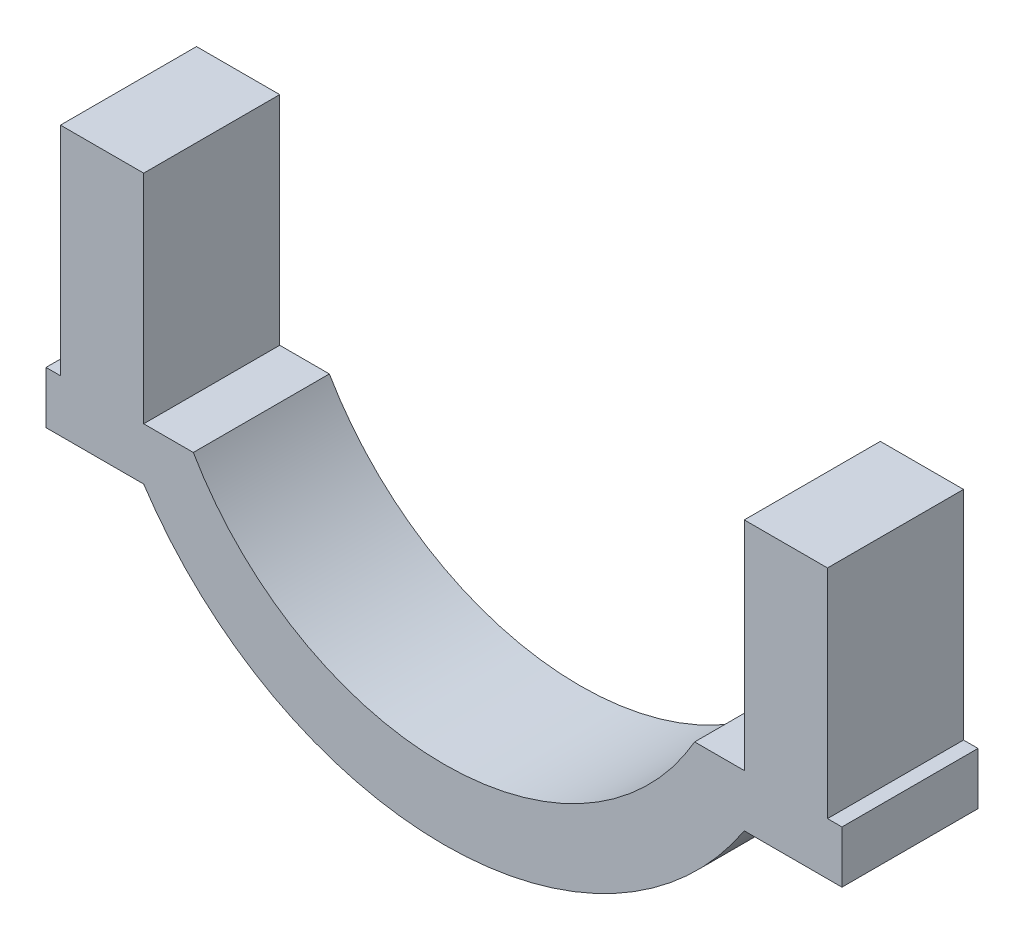
ISO-10303-21;
HEADER;
FILE_DESCRIPTION(('STEP AP214'),'2;1');
FILE_NAME('part.step','',(''),(''),'','','');
FILE_SCHEMA(('AUTOMOTIVE_DESIGN { 1 0 10303 214 1 1 1 1 }'));
ENDSEC;
DATA;
#1=APPLICATION_CONTEXT('core data for automotive mechanical design processes');
#2=APPLICATION_PROTOCOL_DEFINITION('international standard','automotive_design',2000,#1);
#3=PRODUCT_CONTEXT('',#1,'mechanical');
#4=PRODUCT('Part','Part','',(#3));
#5=PRODUCT_RELATED_PRODUCT_CATEGORY('part','',(#4));
#6=PRODUCT_DEFINITION_FORMATION('','',#4);
#7=PRODUCT_DEFINITION_CONTEXT('part definition',#1,'design');
#8=PRODUCT_DEFINITION('design','',#6,#7);
#9=PRODUCT_DEFINITION_SHAPE('','',#8);
#10=(LENGTH_UNIT() NAMED_UNIT(*) SI_UNIT(.MILLI.,.METRE.));
#11=(NAMED_UNIT(*) PLANE_ANGLE_UNIT() SI_UNIT($,.RADIAN.));
#12=(NAMED_UNIT(*) SI_UNIT($,.STERADIAN.) SOLID_ANGLE_UNIT());
#13=UNCERTAINTY_MEASURE_WITH_UNIT(LENGTH_MEASURE(1.E-05),#10,'distance_accuracy_value','');
#14=(GEOMETRIC_REPRESENTATION_CONTEXT(3) GLOBAL_UNCERTAINTY_ASSIGNED_CONTEXT((#13)) GLOBAL_UNIT_ASSIGNED_CONTEXT((#10,
#11,#12)) REPRESENTATION_CONTEXT('',''));
#15=CARTESIAN_POINT('',(0.,0.,0.));
#16=DIRECTION('',(0.,0.,1.));
#17=DIRECTION('',(1.,0.,0.));
#18=AXIS2_PLACEMENT_3D('',#15,#16,#17);
#19=CARTESIAN_POINT('',(52.9999999999999,9.99999999999999,-18.8));
#20=DIRECTION('',(1.,0.,0.));
#21=DIRECTION('',(0.,0.,-1.));
#22=AXIS2_PLACEMENT_3D('',#19,#20,#21);
#23=PLANE('',#22);
#24=DIRECTION('',(0.,1.,0.));
#25=VECTOR('',#24,1.);
#26=CARTESIAN_POINT('',(52.9999999999999,9.99999999999999,0.));
#27=LINE('',#26,#25);
#28=CARTESIAN_POINT('',(52.9999999999999,-20.,0.));
#29=VERTEX_POINT('',#28);
#30=CARTESIAN_POINT('',(52.9999999999999,9.99999999999999,0.));
#31=VERTEX_POINT('',#30);
#32=EDGE_CURVE('E178',#29,#31,#27,.T.);
#33=ORIENTED_EDGE('',*,*,#32,.F.);
#34=DIRECTION('',(0.,0.,1.));
#35=VECTOR('',#34,1.);
#36=CARTESIAN_POINT('',(52.9999999999999,-20.,-18.8));
#37=LINE('',#36,#35);
#38=CARTESIAN_POINT('',(52.9999999999999,-20.,-18.8));
#39=VERTEX_POINT('',#38);
#40=EDGE_CURVE('E11',#39,#29,#37,.T.);
#41=ORIENTED_EDGE('',*,*,#40,.F.);
#42=DIRECTION('',(0.,1.,0.));
#43=VECTOR('',#42,1.);
#44=CARTESIAN_POINT('',(52.9999999999999,9.99999999999999,-18.8));
#45=LINE('',#44,#43);
#46=CARTESIAN_POINT('',(52.9999999999999,9.99999999999999,-18.8));
#47=VERTEX_POINT('',#46);
#48=EDGE_CURVE('E222',#39,#47,#45,.T.);
#49=ORIENTED_EDGE('',*,*,#48,.T.);
#50=DIRECTION('',(0.,0.,1.));
#51=VECTOR('',#50,1.);
#52=CARTESIAN_POINT('',(52.9999999999999,9.99999999999999,-18.8));
#53=LINE('',#52,#51);
#54=EDGE_CURVE('E36',#47,#31,#53,.T.);
#55=ORIENTED_EDGE('',*,*,#54,.T.);
#56=EDGE_LOOP('',(#33,#41,#49,#55));
#57=FACE_BOUND('',#56,.T.);
#58=ADVANCED_FACE('F33',(#57),#23,.T.);
#59=CARTESIAN_POINT('',(52.9999999999999,-20.,-18.8));
#60=DIRECTION('',(0.,1.,0.));
#61=DIRECTION('',(-1.,0.,0.));
#62=AXIS2_PLACEMENT_3D('',#59,#60,#61);
#63=PLANE('',#62);
#64=DIRECTION('',(-1.,0.,0.));
#65=VECTOR('',#64,1.);
#66=CARTESIAN_POINT('',(52.9999999999999,-20.,0.));
#67=LINE('',#66,#65);
#68=CARTESIAN_POINT('',(55.,-20.,0.));
#69=VERTEX_POINT('',#68);
#70=EDGE_CURVE('E220',#69,#29,#67,.T.);
#71=ORIENTED_EDGE('',*,*,#70,.F.);
#72=DIRECTION('',(0.,0.,1.));
#73=VECTOR('',#72,1.);
#74=CARTESIAN_POINT('',(55.,-20.,-18.8));
#75=LINE('',#74,#73);
#76=CARTESIAN_POINT('',(55.,-20.,-18.8));
#77=VERTEX_POINT('',#76);
#78=EDGE_CURVE('E42',#77,#69,#75,.T.);
#79=ORIENTED_EDGE('',*,*,#78,.F.);
#80=DIRECTION('',(-1.,0.,0.));
#81=VECTOR('',#80,1.);
#82=CARTESIAN_POINT('',(52.9999999999999,-20.,-18.8));
#83=LINE('',#82,#81);
#84=EDGE_CURVE('E168',#77,#39,#83,.T.);
#85=ORIENTED_EDGE('',*,*,#84,.T.);
#86=ORIENTED_EDGE('',*,*,#40,.T.);
#87=EDGE_LOOP('',(#71,#79,#85,#86));
#88=FACE_BOUND('',#87,.T.);
#89=ADVANCED_FACE('F250',(#88),#63,.T.);
#90=CARTESIAN_POINT('',(55.,-20.,-18.8));
#91=DIRECTION('',(1.,0.,0.));
#92=DIRECTION('',(0.,0.,-1.));
#93=AXIS2_PLACEMENT_3D('',#90,#91,#92);
#94=PLANE('',#93);
#95=DIRECTION('',(0.,1.,0.));
#96=VECTOR('',#95,1.);
#97=CARTESIAN_POINT('',(55.,-20.,0.));
#98=LINE('',#97,#96);
#99=CARTESIAN_POINT('',(55.,-27.2123332343027,0.));
#100=VERTEX_POINT('',#99);
#101=EDGE_CURVE('E155',#100,#69,#98,.T.);
#102=ORIENTED_EDGE('',*,*,#101,.F.);
#103=DIRECTION('',(0.,0.,1.));
#104=VECTOR('',#103,1.);
#105=CARTESIAN_POINT('',(55.,-27.2123332343027,-18.8));
#106=LINE('',#105,#104);
#107=CARTESIAN_POINT('',(55.,-27.2123332343027,-18.8));
#108=VERTEX_POINT('',#107);
#109=EDGE_CURVE('E150',#108,#100,#106,.T.);
#110=ORIENTED_EDGE('',*,*,#109,.F.);
#111=DIRECTION('',(0.,1.,0.));
#112=VECTOR('',#111,1.);
#113=CARTESIAN_POINT('',(55.,-20.,-18.8));
#114=LINE('',#113,#112);
#115=EDGE_CURVE('E153',#108,#77,#114,.T.);
#116=ORIENTED_EDGE('',*,*,#115,.T.);
#117=ORIENTED_EDGE('',*,*,#78,.T.);
#118=EDGE_LOOP('',(#102,#110,#116,#117));
#119=FACE_BOUND('',#118,.T.);
#120=ADVANCED_FACE('F152',(#119),#94,.T.);
#121=CARTESIAN_POINT('',(55.,-27.2123332343027,-18.8));
#122=DIRECTION('',(0.,-1.,0.));
#123=DIRECTION('',(0.,0.,-1.));
#124=AXIS2_PLACEMENT_3D('',#121,#122,#123);
#125=PLANE('',#124);
#126=DIRECTION('',(1.,0.,0.));
#127=VECTOR('',#126,1.);
#128=CARTESIAN_POINT('',(55.,-27.2123332343027,0.));
#129=LINE('',#128,#127);
#130=CARTESIAN_POINT('',(41.4999999999999,-27.2123332343027,0.));
#131=VERTEX_POINT('',#130);
#132=EDGE_CURVE('E217',#131,#100,#129,.T.);
#133=ORIENTED_EDGE('',*,*,#132,.F.);
#134=DIRECTION('',(0.,0.,1.));
#135=VECTOR('',#134,1.);
#136=CARTESIAN_POINT('',(41.4999999999999,-27.2123332343027,-18.8));
#137=LINE('',#136,#135);
#138=CARTESIAN_POINT('',(41.4999999999999,-27.2123332343027,-18.8));
#139=VERTEX_POINT('',#138);
#140=EDGE_CURVE('E160',#139,#131,#137,.T.);
#141=ORIENTED_EDGE('',*,*,#140,.F.);
#142=DIRECTION('',(1.,0.,0.));
#143=VECTOR('',#142,1.);
#144=CARTESIAN_POINT('',(55.,-27.2123332343027,-18.8));
#145=LINE('',#144,#143);
#146=EDGE_CURVE('E166',#139,#108,#145,.T.);
#147=ORIENTED_EDGE('',*,*,#146,.T.);
#148=ORIENTED_EDGE('',*,*,#109,.T.);
#149=EDGE_LOOP('',(#133,#141,#147,#148));
#150=FACE_BOUND('',#149,.T.);
#151=ADVANCED_FACE('F170',(#150),#125,.T.);
#152=CARTESIAN_POINT('',(0.,0.,-18.8));
#153=DIRECTION('',(0.,0.,1.));
#154=DIRECTION('',(1.,0.,0.));
#155=AXIS2_PLACEMENT_3D('',#152,#153,#154);
#156=CYLINDRICAL_SURFACE('',#155,49.6262136381039);
#157=CARTESIAN_POINT('',(0.,0.,0.));
#158=DIRECTION('',(0.,0.,1.));
#159=DIRECTION('',(-1.,0.,0.));
#160=AXIS2_PLACEMENT_3D('',#157,#158,#159);
#161=CIRCLE('',#160,49.6262136381039);
#162=CARTESIAN_POINT('',(-41.5,-27.2123332343027,0.));
#163=VERTEX_POINT('',#162);
#164=EDGE_CURVE('E214',#163,#131,#161,.T.);
#165=ORIENTED_EDGE('',*,*,#164,.F.);
#166=DIRECTION('',(0.,0.,1.));
#167=VECTOR('',#166,1.);
#168=CARTESIAN_POINT('',(-41.5,-27.2123332343027,-18.8));
#169=LINE('',#168,#167);
#170=CARTESIAN_POINT('',(-41.5,-27.2123332343027,-18.8));
#171=VERTEX_POINT('',#170);
#172=EDGE_CURVE('E226',#171,#163,#169,.T.);
#173=ORIENTED_EDGE('',*,*,#172,.F.);
#174=CARTESIAN_POINT('',(0.,0.,-18.8));
#175=DIRECTION('',(0.,0.,1.));
#176=DIRECTION('',(-1.,0.,0.));
#177=AXIS2_PLACEMENT_3D('',#174,#175,#176);
#178=CIRCLE('',#177,49.6262136381039);
#179=EDGE_CURVE('E171',#171,#139,#178,.T.);
#180=ORIENTED_EDGE('',*,*,#179,.T.);
#181=ORIENTED_EDGE('',*,*,#140,.T.);
#182=EDGE_LOOP('',(#165,#173,#180,#181));
#183=FACE_BOUND('',#182,.T.);
#184=ADVANCED_FACE('F263',(#183),#156,.T.);
#185=CARTESIAN_POINT('',(-55.0000000000001,-27.2123332343027,-18.8));
#186=DIRECTION('',(0.,-1.,0.));
#187=DIRECTION('',(0.,0.,-1.));
#188=AXIS2_PLACEMENT_3D('',#185,#186,#187);
#189=PLANE('',#188);
#190=DIRECTION('',(1.,0.,0.));
#191=VECTOR('',#190,1.);
#192=CARTESIAN_POINT('',(-55.0000000000001,-27.2123332343027,0.));
#193=LINE('',#192,#191);
#194=CARTESIAN_POINT('',(-55.0000000000001,-27.2123332343027,0.));
#195=VERTEX_POINT('',#194);
#196=EDGE_CURVE('E211',#195,#163,#193,.T.);
#197=ORIENTED_EDGE('',*,*,#196,.F.);
#198=DIRECTION('',(0.,0.,1.));
#199=VECTOR('',#198,1.);
#200=CARTESIAN_POINT('',(-55.0000000000001,-27.2123332343027,-18.8));
#201=LINE('',#200,#199);
#202=CARTESIAN_POINT('',(-55.0000000000001,-27.2123332343027,-18.8));
#203=VERTEX_POINT('',#202);
#204=EDGE_CURVE('E228',#203,#195,#201,.T.);
#205=ORIENTED_EDGE('',*,*,#204,.F.);
#206=DIRECTION('',(1.,0.,0.));
#207=VECTOR('',#206,1.);
#208=CARTESIAN_POINT('',(-55.0000000000001,-27.2123332343027,-18.8));
#209=LINE('',#208,#207);
#210=EDGE_CURVE('E173',#203,#171,#209,.T.);
#211=ORIENTED_EDGE('',*,*,#210,.T.);
#212=ORIENTED_EDGE('',*,*,#172,.T.);
#213=EDGE_LOOP('',(#197,#205,#211,#212));
#214=FACE_BOUND('',#213,.T.);
#215=ADVANCED_FACE('F266',(#214),#189,.T.);
#216=CARTESIAN_POINT('',(-55.0000000000001,-20.,-18.8));
#217=DIRECTION('',(-1.,0.,0.));
#218=DIRECTION('',(0.,-1.,0.));
#219=AXIS2_PLACEMENT_3D('',#216,#217,#218);
#220=PLANE('',#219);
#221=DIRECTION('',(0.,-1.,0.));
#222=VECTOR('',#221,1.);
#223=CARTESIAN_POINT('',(-55.0000000000001,-20.,0.));
#224=LINE('',#223,#222);
#225=CARTESIAN_POINT('',(-55.0000000000001,-20.,0.));
#226=VERTEX_POINT('',#225);
#227=EDGE_CURVE('E208',#226,#195,#224,.T.);
#228=ORIENTED_EDGE('',*,*,#227,.F.);
#229=DIRECTION('',(0.,0.,1.));
#230=VECTOR('',#229,1.);
#231=CARTESIAN_POINT('',(-55.0000000000001,-20.,-18.8));
#232=LINE('',#231,#230);
#233=CARTESIAN_POINT('',(-55.0000000000001,-20.,-18.8));
#234=VERTEX_POINT('',#233);
#235=EDGE_CURVE('E230',#234,#226,#232,.T.);
#236=ORIENTED_EDGE('',*,*,#235,.F.);
#237=DIRECTION('',(0.,-1.,0.));
#238=VECTOR('',#237,1.);
#239=CARTESIAN_POINT('',(-55.0000000000001,-20.,-18.8));
#240=LINE('',#239,#238);
#241=EDGE_CURVE('E447',#234,#203,#240,.T.);
#242=ORIENTED_EDGE('',*,*,#241,.T.);
#243=ORIENTED_EDGE('',*,*,#204,.T.);
#244=EDGE_LOOP('',(#228,#236,#242,#243));
#245=FACE_BOUND('',#244,.T.);
#246=ADVANCED_FACE('F270',(#245),#220,.T.);
#247=CARTESIAN_POINT('',(-53.0000000000001,-20.,-18.8));
#248=DIRECTION('',(0.,1.,0.));
#249=DIRECTION('',(0.,0.,1.));
#250=AXIS2_PLACEMENT_3D('',#247,#248,#249);
#251=PLANE('',#250);
#252=DIRECTION('',(-1.,0.,0.));
#253=VECTOR('',#252,1.);
#254=CARTESIAN_POINT('',(-53.0000000000001,-20.,0.));
#255=LINE('',#254,#253);
#256=CARTESIAN_POINT('',(-53.0000000000001,-20.,0.));
#257=VERTEX_POINT('',#256);
#258=EDGE_CURVE('E205',#257,#226,#255,.T.);
#259=ORIENTED_EDGE('',*,*,#258,.F.);
#260=DIRECTION('',(0.,0.,1.));
#261=VECTOR('',#260,1.);
#262=CARTESIAN_POINT('',(-53.0000000000001,-20.,-18.8));
#263=LINE('',#262,#261);
#264=CARTESIAN_POINT('',(-53.0000000000001,-20.,-18.8));
#265=VERTEX_POINT('',#264);
#266=EDGE_CURVE('E232',#265,#257,#263,.T.);
#267=ORIENTED_EDGE('',*,*,#266,.F.);
#268=DIRECTION('',(-1.,0.,0.));
#269=VECTOR('',#268,1.);
#270=CARTESIAN_POINT('',(-53.0000000000001,-20.,-18.8));
#271=LINE('',#270,#269);
#272=EDGE_CURVE('E443',#265,#234,#271,.T.);
#273=ORIENTED_EDGE('',*,*,#272,.T.);
#274=ORIENTED_EDGE('',*,*,#235,.T.);
#275=EDGE_LOOP('',(#259,#267,#273,#274));
#276=FACE_BOUND('',#275,.T.);
#277=ADVANCED_FACE('F274',(#276),#251,.T.);
#278=CARTESIAN_POINT('',(-53.0000000000001,10.,-18.8));
#279=DIRECTION('',(-1.,0.,0.));
#280=DIRECTION('',(0.,0.,1.));
#281=AXIS2_PLACEMENT_3D('',#278,#279,#280);
#282=PLANE('',#281);
#283=DIRECTION('',(0.,-1.,0.));
#284=VECTOR('',#283,1.);
#285=CARTESIAN_POINT('',(-53.0000000000001,10.,0.));
#286=LINE('',#285,#284);
#287=CARTESIAN_POINT('',(-53.0000000000001,10.,0.));
#288=VERTEX_POINT('',#287);
#289=EDGE_CURVE('E202',#288,#257,#286,.T.);
#290=ORIENTED_EDGE('',*,*,#289,.F.);
#291=DIRECTION('',(0.,0.,1.));
#292=VECTOR('',#291,1.);
#293=CARTESIAN_POINT('',(-53.0000000000001,10.,-18.8));
#294=LINE('',#293,#292);
#295=CARTESIAN_POINT('',(-53.0000000000001,10.,-18.8));
#296=VERTEX_POINT('',#295);
#297=EDGE_CURVE('E234',#296,#288,#294,.T.);
#298=ORIENTED_EDGE('',*,*,#297,.F.);
#299=DIRECTION('',(0.,-1.,0.));
#300=VECTOR('',#299,1.);
#301=CARTESIAN_POINT('',(-53.0000000000001,10.,-18.8));
#302=LINE('',#301,#300);
#303=EDGE_CURVE('E454',#296,#265,#302,.T.);
#304=ORIENTED_EDGE('',*,*,#303,.T.);
#305=ORIENTED_EDGE('',*,*,#266,.T.);
#306=EDGE_LOOP('',(#290,#298,#304,#305));
#307=FACE_BOUND('',#306,.T.);
#308=ADVANCED_FACE('F278',(#307),#282,.T.);
#309=CARTESIAN_POINT('',(-41.5000000000001,10.,-18.8));
#310=DIRECTION('',(0.,1.,0.));
#311=DIRECTION('',(0.,0.,1.));
#312=AXIS2_PLACEMENT_3D('',#309,#310,#311);
#313=PLANE('',#312);
#314=DIRECTION('',(-1.,0.,0.));
#315=VECTOR('',#314,1.);
#316=CARTESIAN_POINT('',(-41.5000000000001,10.,0.));
#317=LINE('',#316,#315);
#318=CARTESIAN_POINT('',(-41.5000000000001,10.,0.));
#319=VERTEX_POINT('',#318);
#320=EDGE_CURVE('E199',#319,#288,#317,.T.);
#321=ORIENTED_EDGE('',*,*,#320,.F.);
#322=DIRECTION('',(0.,0.,1.));
#323=VECTOR('',#322,1.);
#324=CARTESIAN_POINT('',(-41.5000000000001,10.,-18.8));
#325=LINE('',#324,#323);
#326=CARTESIAN_POINT('',(-41.5000000000001,10.,-18.8));
#327=VERTEX_POINT('',#326);
#328=EDGE_CURVE('E236',#327,#319,#325,.T.);
#329=ORIENTED_EDGE('',*,*,#328,.F.);
#330=DIRECTION('',(-1.,0.,0.));
#331=VECTOR('',#330,1.);
#332=CARTESIAN_POINT('',(-41.5000000000001,10.,-18.8));
#333=LINE('',#332,#331);
#334=EDGE_CURVE('E436',#327,#296,#333,.T.);
#335=ORIENTED_EDGE('',*,*,#334,.T.);
#336=ORIENTED_EDGE('',*,*,#297,.T.);
#337=EDGE_LOOP('',(#321,#329,#335,#336));
#338=FACE_BOUND('',#337,.T.);
#339=ADVANCED_FACE('F282',(#338),#313,.T.);
#340=CARTESIAN_POINT('',(-41.5000000000001,10.,-18.8));
#341=DIRECTION('',(1.,0.,0.));
#342=DIRECTION('',(0.,0.,-1.));
#343=AXIS2_PLACEMENT_3D('',#340,#341,#342);
#344=PLANE('',#343);
#345=DIRECTION('',(0.,1.,0.));
#346=VECTOR('',#345,1.);
#347=CARTESIAN_POINT('',(-41.5000000000001,10.,0.));
#348=LINE('',#347,#346);
#349=CARTESIAN_POINT('',(-41.5000000000001,-20.,0.));
#350=VERTEX_POINT('',#349);
#351=EDGE_CURVE('E196',#350,#319,#348,.T.);
#352=ORIENTED_EDGE('',*,*,#351,.F.);
#353=DIRECTION('',(0.,0.,1.));
#354=VECTOR('',#353,1.);
#355=CARTESIAN_POINT('',(-41.5000000000001,-20.,-18.8));
#356=LINE('',#355,#354);
#357=CARTESIAN_POINT('',(-41.5000000000001,-20.,-18.8));
#358=VERTEX_POINT('',#357);
#359=EDGE_CURVE('E238',#358,#350,#356,.T.);
#360=ORIENTED_EDGE('',*,*,#359,.F.);
#361=DIRECTION('',(0.,1.,0.));
#362=VECTOR('',#361,1.);
#363=CARTESIAN_POINT('',(-41.5000000000001,10.,-18.8));
#364=LINE('',#363,#362);
#365=EDGE_CURVE('E432',#358,#327,#364,.T.);
#366=ORIENTED_EDGE('',*,*,#365,.T.);
#367=ORIENTED_EDGE('',*,*,#328,.T.);
#368=EDGE_LOOP('',(#352,#360,#366,#367));
#369=FACE_BOUND('',#368,.T.);
#370=ADVANCED_FACE('F286',(#369),#344,.T.);
#371=CARTESIAN_POINT('',(-41.5000000000001,-20.,-18.8));
#372=DIRECTION('',(0.,1.,0.));
#373=DIRECTION('',(0.,0.,1.));
#374=AXIS2_PLACEMENT_3D('',#371,#372,#373);
#375=PLANE('',#374);
#376=DIRECTION('',(-1.,0.,0.));
#377=VECTOR('',#376,1.);
#378=CARTESIAN_POINT('',(-41.5000000000001,-20.,0.));
#379=LINE('',#378,#377);
#380=CARTESIAN_POINT('',(-34.6410161513776,-20.,0.));
#381=VERTEX_POINT('',#380);
#382=EDGE_CURVE('E193',#381,#350,#379,.T.);
#383=ORIENTED_EDGE('',*,*,#382,.F.);
#384=DIRECTION('',(0.,0.,1.));
#385=VECTOR('',#384,1.);
#386=CARTESIAN_POINT('',(-34.6410161513776,-20.,-18.8));
#387=LINE('',#386,#385);
#388=CARTESIAN_POINT('',(-34.6410161513776,-20.,-18.8));
#389=VERTEX_POINT('',#388);
#390=EDGE_CURVE('E240',#389,#381,#387,.T.);
#391=ORIENTED_EDGE('',*,*,#390,.F.);
#392=DIRECTION('',(-1.,0.,0.));
#393=VECTOR('',#392,1.);
#394=CARTESIAN_POINT('',(-41.5000000000001,-20.,-18.8));
#395=LINE('',#394,#393);
#396=EDGE_CURVE('E458',#389,#358,#395,.T.);
#397=ORIENTED_EDGE('',*,*,#396,.T.);
#398=ORIENTED_EDGE('',*,*,#359,.T.);
#399=EDGE_LOOP('',(#383,#391,#397,#398));
#400=FACE_BOUND('',#399,.T.);
#401=ADVANCED_FACE('F290',(#400),#375,.T.);
#402=CARTESIAN_POINT('',(0.,0.,-18.8));
#403=DIRECTION('',(0.,0.,1.));
#404=DIRECTION('',(1.,0.,0.));
#405=AXIS2_PLACEMENT_3D('',#402,#403,#404);
#406=CYLINDRICAL_SURFACE('',#405,40.);
#407=CARTESIAN_POINT('',(0.,0.,0.));
#408=DIRECTION('',(0.,0.,-1.));
#409=DIRECTION('',(-1.,0.,0.));
#410=AXIS2_PLACEMENT_3D('',#407,#408,#409);
#411=CIRCLE('',#410,40.);
#412=CARTESIAN_POINT('',(34.6410161513775,-20.,0.));
#413=VERTEX_POINT('',#412);
#414=EDGE_CURVE('E190',#413,#381,#411,.T.);
#415=ORIENTED_EDGE('',*,*,#414,.F.);
#416=DIRECTION('',(0.,0.,1.));
#417=VECTOR('',#416,1.);
#418=CARTESIAN_POINT('',(34.6410161513775,-20.,-18.8));
#419=LINE('',#418,#417);
#420=CARTESIAN_POINT('',(34.6410161513775,-20.,-18.8));
#421=VERTEX_POINT('',#420);
#422=EDGE_CURVE('E242',#421,#413,#419,.T.);
#423=ORIENTED_EDGE('',*,*,#422,.F.);
#424=CARTESIAN_POINT('',(0.,0.,-18.8));
#425=DIRECTION('',(0.,0.,-1.));
#426=DIRECTION('',(-1.,0.,0.));
#427=AXIS2_PLACEMENT_3D('',#424,#425,#426);
#428=CIRCLE('',#427,40.);
#429=EDGE_CURVE('E425',#421,#389,#428,.T.);
#430=ORIENTED_EDGE('',*,*,#429,.T.);
#431=ORIENTED_EDGE('',*,*,#390,.T.);
#432=EDGE_LOOP('',(#415,#423,#430,#431));
#433=FACE_BOUND('',#432,.T.);
#434=ADVANCED_FACE('F294',(#433),#406,.F.);
#435=CARTESIAN_POINT('',(41.4999999999999,-20.,-18.8));
#436=DIRECTION('',(0.,1.,0.));
#437=DIRECTION('',(0.,0.,1.));
#438=AXIS2_PLACEMENT_3D('',#435,#436,#437);
#439=PLANE('',#438);
#440=DIRECTION('',(-1.,0.,0.));
#441=VECTOR('',#440,1.);
#442=CARTESIAN_POINT('',(41.4999999999999,-20.,0.));
#443=LINE('',#442,#441);
#444=CARTESIAN_POINT('',(41.4999999999999,-20.,0.));
#445=VERTEX_POINT('',#444);
#446=EDGE_CURVE('E187',#445,#413,#443,.T.);
#447=ORIENTED_EDGE('',*,*,#446,.F.);
#448=DIRECTION('',(0.,0.,1.));
#449=VECTOR('',#448,1.);
#450=CARTESIAN_POINT('',(41.4999999999999,-20.,-18.8));
#451=LINE('',#450,#449);
#452=CARTESIAN_POINT('',(41.4999999999999,-20.,-18.8));
#453=VERTEX_POINT('',#452);
#454=EDGE_CURVE('E244',#453,#445,#451,.T.);
#455=ORIENTED_EDGE('',*,*,#454,.F.);
#456=DIRECTION('',(-1.,0.,0.));
#457=VECTOR('',#456,1.);
#458=CARTESIAN_POINT('',(41.4999999999999,-20.,-18.8));
#459=LINE('',#458,#457);
#460=EDGE_CURVE('E421',#453,#421,#459,.T.);
#461=ORIENTED_EDGE('',*,*,#460,.T.);
#462=ORIENTED_EDGE('',*,*,#422,.T.);
#463=EDGE_LOOP('',(#447,#455,#461,#462));
#464=FACE_BOUND('',#463,.T.);
#465=ADVANCED_FACE('F298',(#464),#439,.T.);
#466=CARTESIAN_POINT('',(41.4999999999999,9.99999999999999,-18.8));
#467=DIRECTION('',(-1.,0.,0.));
#468=DIRECTION('',(0.,0.,1.));
#469=AXIS2_PLACEMENT_3D('',#466,#467,#468);
#470=PLANE('',#469);
#471=DIRECTION('',(0.,-1.,0.));
#472=VECTOR('',#471,1.);
#473=CARTESIAN_POINT('',(41.4999999999999,9.99999999999999,0.));
#474=LINE('',#473,#472);
#475=CARTESIAN_POINT('',(41.4999999999999,9.99999999999999,0.));
#476=VERTEX_POINT('',#475);
#477=EDGE_CURVE('E184',#476,#445,#474,.T.);
#478=ORIENTED_EDGE('',*,*,#477,.F.);
#479=DIRECTION('',(0.,0.,1.));
#480=VECTOR('',#479,1.);
#481=CARTESIAN_POINT('',(41.4999999999999,9.99999999999999,-18.8));
#482=LINE('',#481,#480);
#483=CARTESIAN_POINT('',(41.4999999999999,9.99999999999999,-18.8));
#484=VERTEX_POINT('',#483);
#485=EDGE_CURVE('E245',#484,#476,#482,.T.);
#486=ORIENTED_EDGE('',*,*,#485,.F.);
#487=DIRECTION('',(0.,-1.,0.));
#488=VECTOR('',#487,1.);
#489=CARTESIAN_POINT('',(41.4999999999999,9.99999999999999,-18.8));
#490=LINE('',#489,#488);
#491=EDGE_CURVE('E462',#484,#453,#490,.T.);
#492=ORIENTED_EDGE('',*,*,#491,.T.);
#493=ORIENTED_EDGE('',*,*,#454,.T.);
#494=EDGE_LOOP('',(#478,#486,#492,#493));
#495=FACE_BOUND('',#494,.T.);
#496=ADVANCED_FACE('F302',(#495),#470,.T.);
#497=CARTESIAN_POINT('',(52.9999999999999,9.99999999999999,-18.8));
#498=DIRECTION('',(0.,1.,0.));
#499=DIRECTION('',(0.,0.,1.));
#500=AXIS2_PLACEMENT_3D('',#497,#498,#499);
#501=PLANE('',#500);
#502=DIRECTION('',(-1.,0.,0.));
#503=VECTOR('',#502,1.);
#504=CARTESIAN_POINT('',(52.9999999999999,9.99999999999999,0.));
#505=LINE('',#504,#503);
#506=EDGE_CURVE('E181',#31,#476,#505,.T.);
#507=ORIENTED_EDGE('',*,*,#506,.F.);
#508=ORIENTED_EDGE('',*,*,#54,.F.);
#509=DIRECTION('',(-1.,0.,0.));
#510=VECTOR('',#509,1.);
#511=CARTESIAN_POINT('',(52.9999999999999,9.99999999999999,-18.8));
#512=LINE('',#511,#510);
#513=EDGE_CURVE('E464',#47,#484,#512,.T.);
#514=ORIENTED_EDGE('',*,*,#513,.T.);
#515=ORIENTED_EDGE('',*,*,#485,.T.);
#516=EDGE_LOOP('',(#507,#508,#514,#515));
#517=FACE_BOUND('',#516,.T.);
#518=ADVANCED_FACE('F247',(#517),#501,.T.);
#519=CARTESIAN_POINT('',(0.,0.,-18.8));
#520=DIRECTION('',(0.,0.,-1.));
#521=DIRECTION('',(-1.,0.,0.));
#522=AXIS2_PLACEMENT_3D('',#519,#520,#521);
#523=PLANE('',#522);
#524=ORIENTED_EDGE('',*,*,#48,.F.);
#525=ORIENTED_EDGE('',*,*,#84,.F.);
#526=ORIENTED_EDGE('',*,*,#115,.F.);
#527=ORIENTED_EDGE('',*,*,#146,.F.);
#528=ORIENTED_EDGE('',*,*,#179,.F.);
#529=ORIENTED_EDGE('',*,*,#210,.F.);
#530=ORIENTED_EDGE('',*,*,#241,.F.);
#531=ORIENTED_EDGE('',*,*,#272,.F.);
#532=ORIENTED_EDGE('',*,*,#303,.F.);
#533=ORIENTED_EDGE('',*,*,#334,.F.);
#534=ORIENTED_EDGE('',*,*,#365,.F.);
#535=ORIENTED_EDGE('',*,*,#396,.F.);
#536=ORIENTED_EDGE('',*,*,#429,.F.);
#537=ORIENTED_EDGE('',*,*,#460,.F.);
#538=ORIENTED_EDGE('',*,*,#491,.F.);
#539=ORIENTED_EDGE('',*,*,#513,.F.);
#540=EDGE_LOOP('',(#524,#525,#526,#527,#528,#529,#530,#531,#532,#533,#534,#535,#536,#537,#538,#539));
#541=FACE_BOUND('',#540,.T.);
#542=ADVANCED_FACE('F164',(#541),#523,.T.);
#543=CARTESIAN_POINT('',(0.,0.,0.));
#544=DIRECTION('',(0.,0.,-1.));
#545=DIRECTION('',(-1.,0.,0.));
#546=AXIS2_PLACEMENT_3D('',#543,#544,#545);
#547=PLANE('',#546);
#548=ORIENTED_EDGE('',*,*,#32,.T.);
#549=ORIENTED_EDGE('',*,*,#506,.T.);
#550=ORIENTED_EDGE('',*,*,#477,.T.);
#551=ORIENTED_EDGE('',*,*,#446,.T.);
#552=ORIENTED_EDGE('',*,*,#414,.T.);
#553=ORIENTED_EDGE('',*,*,#382,.T.);
#554=ORIENTED_EDGE('',*,*,#351,.T.);
#555=ORIENTED_EDGE('',*,*,#320,.T.);
#556=ORIENTED_EDGE('',*,*,#289,.T.);
#557=ORIENTED_EDGE('',*,*,#258,.T.);
#558=ORIENTED_EDGE('',*,*,#227,.T.);
#559=ORIENTED_EDGE('',*,*,#196,.T.);
#560=ORIENTED_EDGE('',*,*,#164,.T.);
#561=ORIENTED_EDGE('',*,*,#132,.T.);
#562=ORIENTED_EDGE('',*,*,#101,.T.);
#563=ORIENTED_EDGE('',*,*,#70,.T.);
#564=EDGE_LOOP('',(#548,#549,#550,#551,#552,#553,#554,#555,#556,#557,#558,#559,#560,#561,#562,#563));
#565=FACE_BOUND('',#564,.T.);
#566=ADVANCED_FACE('F249',(#565),#547,.F.);
#567=CLOSED_SHELL('',(#58,#89,#120,#151,#184,#215,#246,#277,#308,#339,#370,#401,#434,#465,#496,
#518,#542,#566));
#568=MANIFOLD_SOLID_BREP('B2',#567);
#569=ADVANCED_BREP_SHAPE_REPRESENTATION('',(#18,#568),#14);
#570=SHAPE_DEFINITION_REPRESENTATION(#9,#569);
ENDSEC;
END-ISO-10303-21;
